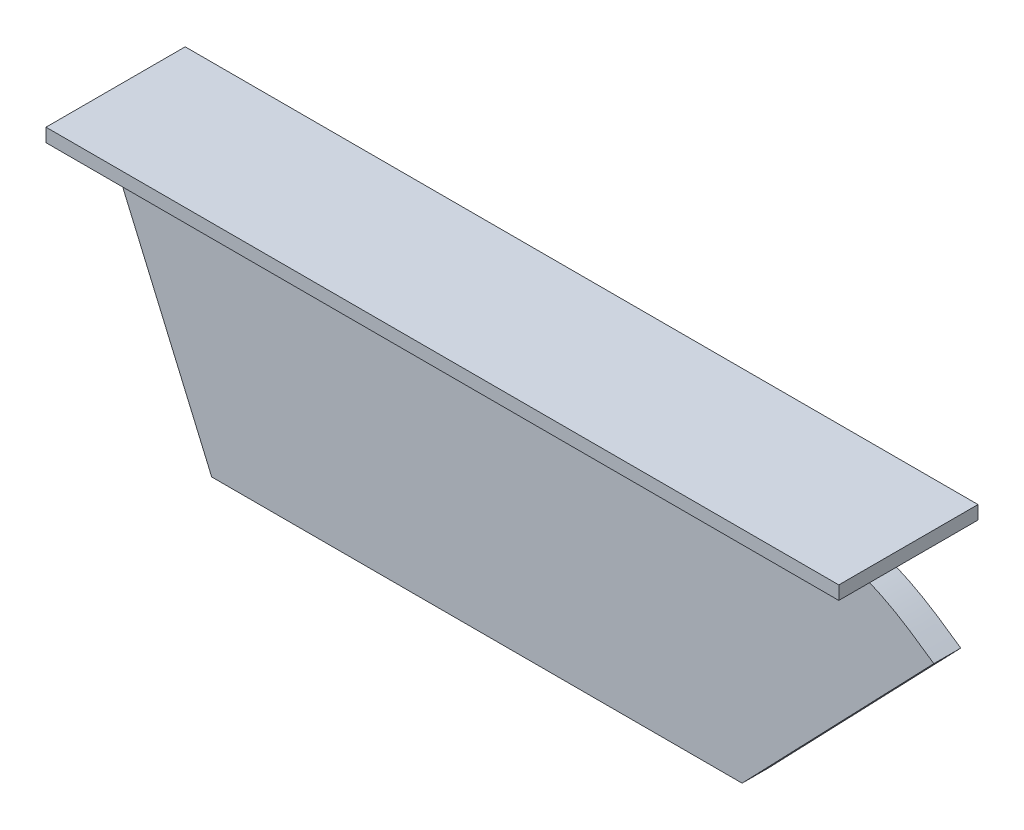
ISO-10303-21;
HEADER;
FILE_DESCRIPTION(('STEP AP214'),'2;1');
FILE_NAME('part.step','',(''),(''),'','','');
FILE_SCHEMA(('AUTOMOTIVE_DESIGN { 1 0 10303 214 1 1 1 1 }'));
ENDSEC;
DATA;
#1=APPLICATION_CONTEXT('core data for automotive mechanical design processes');
#2=APPLICATION_PROTOCOL_DEFINITION('international standard','automotive_design',2000,#1);
#3=PRODUCT_CONTEXT('',#1,'mechanical');
#4=PRODUCT('Part','Part','',(#3));
#5=PRODUCT_RELATED_PRODUCT_CATEGORY('part','',(#4));
#6=PRODUCT_DEFINITION_FORMATION('','',#4);
#7=PRODUCT_DEFINITION_CONTEXT('part definition',#1,'design');
#8=PRODUCT_DEFINITION('design','',#6,#7);
#9=PRODUCT_DEFINITION_SHAPE('','',#8);
#10=(LENGTH_UNIT() NAMED_UNIT(*) SI_UNIT(.MILLI.,.METRE.));
#11=(NAMED_UNIT(*) PLANE_ANGLE_UNIT() SI_UNIT($,.RADIAN.));
#12=(NAMED_UNIT(*) SI_UNIT($,.STERADIAN.) SOLID_ANGLE_UNIT());
#13=UNCERTAINTY_MEASURE_WITH_UNIT(LENGTH_MEASURE(1.E-05),#10,'distance_accuracy_value','');
#14=(GEOMETRIC_REPRESENTATION_CONTEXT(3) GLOBAL_UNCERTAINTY_ASSIGNED_CONTEXT((#13)) GLOBAL_UNIT_ASSIGNED_CONTEXT((#10,
#11,#12)) REPRESENTATION_CONTEXT('',''));
#15=CARTESIAN_POINT('',(0.,0.,0.));
#16=DIRECTION('',(0.,0.,1.));
#17=DIRECTION('',(1.,0.,0.));
#18=AXIS2_PLACEMENT_3D('',#15,#16,#17);
#19=CARTESIAN_POINT('',(14.9219959076632,5.49515134803942,0.));
#20=DIRECTION('',(0.,0.,-1.));
#21=DIRECTION('',(-1.,0.,0.));
#22=AXIS2_PLACEMENT_3D('',#19,#20,#21);
#23=PLANE('',#22);
#24=DIRECTION('',(-0.99488208865454,-0.101042712128979,0.));
#25=VECTOR('',#24,1.);
#26=CARTESIAN_POINT('',(14.5717616648174,8.94361158529031,0.));
#27=LINE('',#26,#25);
#28=CARTESIAN_POINT('',(-16.2112308203431,5.81721391101613,0.));
#29=VERTEX_POINT('',#28);
#30=CARTESIAN_POINT('',(-18.5524966546456,5.57942909971978,0.));
#31=VERTEX_POINT('',#30);
#32=EDGE_CURVE('E244',#29,#31,#27,.T.);
#33=ORIENTED_EDGE('',*,*,#32,.F.);
#34=DIRECTION('',(-1.,0.,0.));
#35=VECTOR('',#34,1.);
#36=CARTESIAN_POINT('',(14.9219959076632,5.81721391101613,0.));
#37=LINE('',#36,#35);
#38=CARTESIAN_POINT('',(10.5330727730155,5.81721391101613,0.));
#39=VERTEX_POINT('',#38);
#40=EDGE_CURVE('E119',#39,#29,#37,.T.);
#41=ORIENTED_EDGE('',*,*,#40,.F.);
#42=CARTESIAN_POINT('',(18.5375217741267,3.06940593852388,0.));
#43=CARTESIAN_POINT('',(17.947435083279,3.48376291672778,0.));
#44=CARTESIAN_POINT('',(17.3567712330806,3.89722808046411,0.));
#45=CARTESIAN_POINT('',(16.0978345123881,4.60423858505077,0.));
#46=CARTESIAN_POINT('',(15.4411782556395,4.89047439036039,0.));
#47=CARTESIAN_POINT('',(14.0969321608219,5.3592871656972,0.));
#48=CARTESIAN_POINT('',(13.407610170471,5.54292799800482,0.));
#49=CARTESIAN_POINT('',(11.977353684071,5.75786672362895,0.));
#50=CARTESIAN_POINT('',(11.2548253057176,5.78719905409013,0.));
#51=CARTESIAN_POINT('',(10.5330727730155,5.81721391101613,0.));
#52=B_SPLINE_CURVE_WITH_KNOTS('',3,(#42,#43,#44,#45,#46,#47,#48,#49,#50,#51),.UNSPECIFIED.,.F.,
.F.,(4,2,2,2,4),(0.,0.25,0.5,0.75,1.),.UNSPECIFIED.);
#53=CARTESIAN_POINT('',(18.5375217741267,3.06940593852388,0.));
#54=VERTEX_POINT('',#53);
#55=EDGE_CURVE('E261',#54,#39,#52,.T.);
#56=ORIENTED_EDGE('',*,*,#55,.F.);
#57=DIRECTION('',(0.693079494299739,0.720861161792767,0.));
#58=VECTOR('',#57,1.);
#59=CARTESIAN_POINT('',(18.0127072981266,2.52355459534235,0.));
#60=LINE('',#59,#58);
#61=CARTESIAN_POINT('',(9.9933882879564,-5.81721391101613,0.));
#62=VERTEX_POINT('',#61);
#63=EDGE_CURVE('E257',#62,#54,#60,.T.);
#64=ORIENTED_EDGE('',*,*,#63,.F.);
#65=DIRECTION('',(1.,0.,0.));
#66=VECTOR('',#65,1.);
#67=CARTESIAN_POINT('',(14.9219959076632,-5.81721391101613,0.));
#68=LINE('',#67,#66);
#69=CARTESIAN_POINT('',(-13.6448513390177,-5.81721391101613,0.));
#70=VERTEX_POINT('',#69);
#71=EDGE_CURVE('E253',#70,#62,#68,.T.);
#72=ORIENTED_EDGE('',*,*,#71,.F.);
#73=DIRECTION('',(0.395509839888418,-0.918461739296438,0.));
#74=VECTOR('',#73,1.);
#75=CARTESIAN_POINT('',(-13.2855328211196,-6.65163135813499,0.));
#76=LINE('',#75,#74);
#77=EDGE_CURVE('E249',#31,#70,#76,.T.);
#78=ORIENTED_EDGE('',*,*,#77,.F.);
#79=EDGE_LOOP('',(#33,#41,#56,#64,#72,#78));
#80=FACE_BOUND('',#79,.T.);
#81=ADVANCED_FACE('F94',(#80),#23,.T.);
#82=CARTESIAN_POINT('',(14.9219959076632,5.81721391101613,0.));
#83=DIRECTION('',(0.,1.,0.));
#84=DIRECTION('',(0.,0.,1.));
#85=AXIS2_PLACEMENT_3D('',#82,#83,#84);
#86=PLANE('',#85);
#87=CARTESIAN_POINT('',(10.1887691796569,5.81721391101613,0.599999999999999));
#88=DIRECTION('',(0.,1.,0.));
#89=DIRECTION('',(0.,0.,1.));
#90=AXIS2_PLACEMENT_3D('',#87,#88,#89);
#91=CIRCLE('',#90,0.3);
#92=CARTESIAN_POINT('',(10.1887691796569,5.81721391101613,0.899999999999999));
#93=VERTEX_POINT('',#92);
#94=EDGE_CURVE('E208',#93,#93,#91,.T.);
#95=ORIENTED_EDGE('',*,*,#94,.F.);
#96=EDGE_LOOP('',(#95));
#97=FACE_BOUND('',#96,.T.);
#98=CARTESIAN_POINT('',(1.48876917965688,5.81721391101613,0.599999999999999));
#99=DIRECTION('',(0.,1.,0.));
#100=DIRECTION('',(0.,0.,1.));
#101=AXIS2_PLACEMENT_3D('',#98,#99,#100);
#102=CIRCLE('',#101,0.3);
#103=CARTESIAN_POINT('',(1.48876917965688,5.81721391101613,0.899999999999999));
#104=VERTEX_POINT('',#103);
#105=EDGE_CURVE('E218',#104,#104,#102,.T.);
#106=ORIENTED_EDGE('',*,*,#105,.F.);
#107=EDGE_LOOP('',(#106));
#108=FACE_BOUND('',#107,.T.);
#109=CARTESIAN_POINT('',(-7.21123082034312,5.81721391101613,0.599999999999999));
#110=DIRECTION('',(0.,1.,0.));
#111=DIRECTION('',(0.,0.,1.));
#112=AXIS2_PLACEMENT_3D('',#109,#110,#111);
#113=CIRCLE('',#112,0.3);
#114=CARTESIAN_POINT('',(-7.21123082034312,5.81721391101613,0.899999999999999));
#115=VERTEX_POINT('',#114);
#116=EDGE_CURVE('E226',#115,#115,#113,.T.);
#117=ORIENTED_EDGE('',*,*,#116,.F.);
#118=EDGE_LOOP('',(#117));
#119=FACE_BOUND('',#118,.T.);
#120=DIRECTION('',(0.,0.,1.));
#121=VECTOR('',#120,1.);
#122=CARTESIAN_POINT('',(-16.2112308203431,5.81721391101613,0.));
#123=LINE('',#122,#121);
#124=CARTESIAN_POINT('',(-16.2112308203431,5.81721391101613,0.599999999999999));
#125=VERTEX_POINT('',#124);
#126=EDGE_CURVE('E97',#29,#125,#123,.T.);
#127=ORIENTED_EDGE('',*,*,#126,.T.);
#128=CARTESIAN_POINT('',(-15.9112308203431,5.81721391101613,0.599999999999999));
#129=DIRECTION('',(0.,1.,0.));
#130=DIRECTION('',(0.,0.,1.));
#131=AXIS2_PLACEMENT_3D('',#128,#129,#130);
#132=CIRCLE('',#131,0.3);
#133=EDGE_CURVE('E230',#125,#125,#132,.T.);
#134=ORIENTED_EDGE('',*,*,#133,.F.);
#135=CARTESIAN_POINT('',(-16.2112308203431,5.81721391101613,1.2));
#136=VERTEX_POINT('',#135);
#137=EDGE_CURVE('E268',#125,#136,#123,.T.);
#138=ORIENTED_EDGE('',*,*,#137,.T.);
#139=DIRECTION('',(-1.,0.,0.));
#140=VECTOR('',#139,1.);
#141=CARTESIAN_POINT('',(14.9219959076632,5.81721391101613,1.2));
#142=LINE('',#141,#140);
#143=CARTESIAN_POINT('',(10.5330727730155,5.81721391101613,1.2));
#144=VERTEX_POINT('',#143);
#145=EDGE_CURVE('E238',#144,#136,#142,.T.);
#146=ORIENTED_EDGE('',*,*,#145,.F.);
#147=DIRECTION('',(0.,0.,1.));
#148=VECTOR('',#147,1.);
#149=CARTESIAN_POINT('',(10.5330727730155,5.81721391101613,0.));
#150=LINE('',#149,#148);
#151=EDGE_CURVE('E12',#39,#144,#150,.T.);
#152=ORIENTED_EDGE('',*,*,#151,.F.);
#153=ORIENTED_EDGE('',*,*,#40,.T.);
#154=EDGE_LOOP('',(#127,#134,#138,#146,#152,#153));
#155=FACE_BOUND('',#154,.T.);
#156=ADVANCED_FACE('F279',(#97,#108,#119,#155),#86,.T.);
#157=DIRECTION('',(0.,0.,1.));
#158=VECTOR('',#157,1.);
#159=SURFACE_OF_LINEAR_EXTRUSION('',#52,#158);
#160=CARTESIAN_POINT('',(18.5375217741267,3.06940593852388,1.2));
#161=CARTESIAN_POINT('',(17.947435083279,3.48376291672778,1.2));
#162=CARTESIAN_POINT('',(17.3567712330806,3.89722808046411,1.2));
#163=CARTESIAN_POINT('',(16.0978345123881,4.60423858505077,1.2));
#164=CARTESIAN_POINT('',(15.4411782556395,4.89047439036039,1.2));
#165=CARTESIAN_POINT('',(14.0969321608219,5.3592871656972,1.2));
#166=CARTESIAN_POINT('',(13.407610170471,5.54292799800482,1.2));
#167=CARTESIAN_POINT('',(11.977353684071,5.75786672362895,1.2));
#168=CARTESIAN_POINT('',(11.2548253057176,5.78719905409013,1.2));
#169=CARTESIAN_POINT('',(10.5330727730155,5.81721391101613,1.2));
#170=B_SPLINE_CURVE_WITH_KNOTS('',3,(#160,#161,#162,#163,#164,#165,#166,#167,#168,#169),
.UNSPECIFIED.,.F.,.F.,(4,2,2,2,4),(0.,0.25,0.5,0.75,1.),.UNSPECIFIED.);
#171=CARTESIAN_POINT('',(18.5375217741267,3.06940593852388,1.2));
#172=VERTEX_POINT('',#171);
#173=EDGE_CURVE('E245',#172,#144,#170,.T.);
#174=ORIENTED_EDGE('',*,*,#173,.F.);
#175=DIRECTION('',(0.,0.,1.));
#176=VECTOR('',#175,1.);
#177=CARTESIAN_POINT('',(18.5375217741267,3.06940593852388,0.));
#178=LINE('',#177,#176);
#179=EDGE_CURVE('E103',#54,#172,#178,.T.);
#180=ORIENTED_EDGE('',*,*,#179,.F.);
#181=ORIENTED_EDGE('',*,*,#55,.T.);
#182=ORIENTED_EDGE('',*,*,#151,.T.);
#183=EDGE_LOOP('',(#174,#180,#181,#182));
#184=FACE_BOUND('',#183,.T.);
#185=ADVANCED_FACE('F274',(#184),#159,.T.);
#186=CARTESIAN_POINT('',(18.0127072981266,2.52355459534235,0.));
#187=DIRECTION('',(0.720861161792767,-0.693079494299739,0.));
#188=DIRECTION('',(0.693079494299739,0.720861161792767,0.));
#189=AXIS2_PLACEMENT_3D('',#186,#187,#188);
#190=PLANE('',#189);
#191=DIRECTION('',(0.693079494299739,0.720861161792767,0.));
#192=VECTOR('',#191,1.);
#193=CARTESIAN_POINT('',(18.0127072981266,2.52355459534235,1.2));
#194=LINE('',#193,#192);
#195=CARTESIAN_POINT('',(9.9933882879564,-5.81721391101613,1.2));
#196=VERTEX_POINT('',#195);
#197=EDGE_CURVE('E338',#196,#172,#194,.T.);
#198=ORIENTED_EDGE('',*,*,#197,.F.);
#199=DIRECTION('',(0.,0.,1.));
#200=VECTOR('',#199,1.);
#201=CARTESIAN_POINT('',(9.9933882879564,-5.81721391101613,0.));
#202=LINE('',#201,#200);
#203=EDGE_CURVE('E351',#62,#196,#202,.T.);
#204=ORIENTED_EDGE('',*,*,#203,.F.);
#205=ORIENTED_EDGE('',*,*,#63,.T.);
#206=ORIENTED_EDGE('',*,*,#179,.T.);
#207=EDGE_LOOP('',(#198,#204,#205,#206));
#208=FACE_BOUND('',#207,.T.);
#209=ADVANCED_FACE('F278',(#208),#190,.T.);
#210=CARTESIAN_POINT('',(14.9219959076632,-5.81721391101613,0.));
#211=DIRECTION('',(0.,-1.,0.));
#212=DIRECTION('',(0.,0.,-1.));
#213=AXIS2_PLACEMENT_3D('',#210,#211,#212);
#214=PLANE('',#213);
#215=DIRECTION('',(1.,0.,0.));
#216=VECTOR('',#215,1.);
#217=CARTESIAN_POINT('',(14.9219959076632,-5.81721391101613,1.2));
#218=LINE('',#217,#216);
#219=CARTESIAN_POINT('',(-13.6448513390177,-5.81721391101613,1.2));
#220=VERTEX_POINT('',#219);
#221=EDGE_CURVE('E334',#220,#196,#218,.T.);
#222=ORIENTED_EDGE('',*,*,#221,.F.);
#223=DIRECTION('',(0.,0.,1.));
#224=VECTOR('',#223,1.);
#225=CARTESIAN_POINT('',(-13.6448513390177,-5.81721391101613,0.));
#226=LINE('',#225,#224);
#227=EDGE_CURVE('E324',#70,#220,#226,.T.);
#228=ORIENTED_EDGE('',*,*,#227,.F.);
#229=ORIENTED_EDGE('',*,*,#71,.T.);
#230=ORIENTED_EDGE('',*,*,#203,.T.);
#231=EDGE_LOOP('',(#222,#228,#229,#230));
#232=FACE_BOUND('',#231,.T.);
#233=ADVANCED_FACE('F285',(#232),#214,.T.);
#234=CARTESIAN_POINT('',(-13.2855328211196,-6.65163135813499,0.));
#235=DIRECTION('',(-0.918461739296438,-0.395509839888418,0.));
#236=DIRECTION('',(0.395509839888418,-0.918461739296438,0.));
#237=AXIS2_PLACEMENT_3D('',#234,#235,#236);
#238=PLANE('',#237);
#239=DIRECTION('',(0.395509839888418,-0.918461739296438,0.));
#240=VECTOR('',#239,1.);
#241=CARTESIAN_POINT('',(-13.2855328211196,-6.65163135813499,1.2));
#242=LINE('',#241,#240);
#243=CARTESIAN_POINT('',(-18.5524966546456,5.57942909971978,1.2));
#244=VERTEX_POINT('',#243);
#245=EDGE_CURVE('E111',#244,#220,#242,.T.);
#246=ORIENTED_EDGE('',*,*,#245,.F.);
#247=DIRECTION('',(0.,0.,1.));
#248=VECTOR('',#247,1.);
#249=CARTESIAN_POINT('',(-18.5524966546456,5.57942909971978,0.));
#250=LINE('',#249,#248);
#251=EDGE_CURVE('E317',#31,#244,#250,.T.);
#252=ORIENTED_EDGE('',*,*,#251,.F.);
#253=ORIENTED_EDGE('',*,*,#77,.T.);
#254=ORIENTED_EDGE('',*,*,#227,.T.);
#255=EDGE_LOOP('',(#246,#252,#253,#254));
#256=FACE_BOUND('',#255,.T.);
#257=ADVANCED_FACE('F289',(#256),#238,.T.);
#258=CARTESIAN_POINT('',(14.5717616648174,8.94361158529031,0.));
#259=DIRECTION('',(-0.101042712128979,0.99488208865454,0.));
#260=DIRECTION('',(-0.99488208865454,-0.101042712128979,0.));
#261=AXIS2_PLACEMENT_3D('',#258,#259,#260);
#262=PLANE('',#261);
#263=DIRECTION('',(-0.99488208865454,-0.101042712128979,0.));
#264=VECTOR('',#263,1.);
#265=CARTESIAN_POINT('',(14.5717616648174,8.94361158529031,1.2));
#266=LINE('',#265,#264);
#267=EDGE_CURVE('E327',#136,#244,#266,.T.);
#268=ORIENTED_EDGE('',*,*,#267,.F.);
#269=ORIENTED_EDGE('',*,*,#137,.F.);
#270=ORIENTED_EDGE('',*,*,#126,.F.);
#271=ORIENTED_EDGE('',*,*,#32,.T.);
#272=ORIENTED_EDGE('',*,*,#251,.T.);
#273=EDGE_LOOP('',(#268,#269,#270,#271,#272));
#274=FACE_BOUND('',#273,.T.);
#275=ADVANCED_FACE('F293',(#274),#262,.T.);
#276=CARTESIAN_POINT('',(14.9219959076632,5.49515134803942,1.2));
#277=DIRECTION('',(0.,0.,-1.));
#278=DIRECTION('',(-1.,0.,0.));
#279=AXIS2_PLACEMENT_3D('',#276,#277,#278);
#280=PLANE('',#279);
#281=ORIENTED_EDGE('',*,*,#145,.T.);
#282=ORIENTED_EDGE('',*,*,#267,.T.);
#283=ORIENTED_EDGE('',*,*,#245,.T.);
#284=ORIENTED_EDGE('',*,*,#221,.T.);
#285=ORIENTED_EDGE('',*,*,#197,.T.);
#286=ORIENTED_EDGE('',*,*,#173,.T.);
#287=EDGE_LOOP('',(#281,#282,#283,#284,#285,#286));
#288=FACE_BOUND('',#287,.T.);
#289=ADVANCED_FACE('F296',(#288),#280,.F.);
#290=CARTESIAN_POINT('',(-15.9112308203431,6.11721391101613,0.599999999999999));
#291=DIRECTION('',(0.,-1.,0.));
#292=DIRECTION('',(0.,0.,-1.));
#293=AXIS2_PLACEMENT_3D('',#290,#291,#292);
#294=CYLINDRICAL_SURFACE('',#293,0.3);
#295=CARTESIAN_POINT('',(-15.9112308203431,6.11721391101613,0.599999999999999));
#296=DIRECTION('',(0.,1.,0.));
#297=DIRECTION('',(0.,0.,1.));
#298=AXIS2_PLACEMENT_3D('',#295,#296,#297);
#299=CIRCLE('',#298,0.3);
#300=CARTESIAN_POINT('',(-15.9112308203431,6.11721391101613,0.899999999999999));
#301=VERTEX_POINT('',#300);
#302=EDGE_CURVE('E234',#301,#301,#299,.T.);
#303=ORIENTED_EDGE('',*,*,#302,.F.);
#304=EDGE_LOOP('',(#303));
#305=FACE_BOUND('',#304,.T.);
#306=ORIENTED_EDGE('',*,*,#133,.T.);
#307=EDGE_LOOP('',(#306));
#308=FACE_BOUND('',#307,.T.);
#309=ADVANCED_FACE('F281',(#305,#308),#294,.T.);
#310=CARTESIAN_POINT('',(-7.21123082034312,6.11721391101613,0.599999999999999));
#311=DIRECTION('',(0.,-1.,0.));
#312=DIRECTION('',(0.,0.,-1.));
#313=AXIS2_PLACEMENT_3D('',#310,#311,#312);
#314=CYLINDRICAL_SURFACE('',#313,0.3);
#315=CARTESIAN_POINT('',(-7.21123082034312,6.11721391101613,0.599999999999999));
#316=DIRECTION('',(0.,1.,0.));
#317=DIRECTION('',(0.,0.,1.));
#318=AXIS2_PLACEMENT_3D('',#315,#316,#317);
#319=CIRCLE('',#318,0.3);
#320=CARTESIAN_POINT('',(-7.21123082034312,6.11721391101613,0.899999999999999));
#321=VERTEX_POINT('',#320);
#322=EDGE_CURVE('E222',#321,#321,#319,.T.);
#323=ORIENTED_EDGE('',*,*,#322,.F.);
#324=EDGE_LOOP('',(#323));
#325=FACE_BOUND('',#324,.T.);
#326=ORIENTED_EDGE('',*,*,#116,.T.);
#327=EDGE_LOOP('',(#326));
#328=FACE_BOUND('',#327,.T.);
#329=ADVANCED_FACE('F305',(#325,#328),#314,.T.);
#330=CARTESIAN_POINT('',(1.48876917965688,6.11721391101613,0.599999999999999));
#331=DIRECTION('',(0.,-1.,0.));
#332=DIRECTION('',(0.,0.,-1.));
#333=AXIS2_PLACEMENT_3D('',#330,#331,#332);
#334=CYLINDRICAL_SURFACE('',#333,0.3);
#335=CARTESIAN_POINT('',(1.48876917965688,6.11721391101613,0.599999999999999));
#336=DIRECTION('',(0.,1.,0.));
#337=DIRECTION('',(0.,0.,1.));
#338=AXIS2_PLACEMENT_3D('',#335,#336,#337);
#339=CIRCLE('',#338,0.3);
#340=CARTESIAN_POINT('',(1.48876917965688,6.11721391101613,0.899999999999999));
#341=VERTEX_POINT('',#340);
#342=EDGE_CURVE('E216',#341,#341,#339,.T.);
#343=ORIENTED_EDGE('',*,*,#342,.F.);
#344=EDGE_LOOP('',(#343));
#345=FACE_BOUND('',#344,.T.);
#346=ORIENTED_EDGE('',*,*,#105,.T.);
#347=EDGE_LOOP('',(#346));
#348=FACE_BOUND('',#347,.T.);
#349=ADVANCED_FACE('F400',(#345,#348),#334,.T.);
#350=CARTESIAN_POINT('',(10.1887691796569,6.11721391101613,0.599999999999999));
#351=DIRECTION('',(0.,-1.,0.));
#352=DIRECTION('',(0.,0.,-1.));
#353=AXIS2_PLACEMENT_3D('',#350,#351,#352);
#354=CYLINDRICAL_SURFACE('',#353,0.3);
#355=CARTESIAN_POINT('',(10.1887691796569,6.11721391101613,0.599999999999999));
#356=DIRECTION('',(0.,1.,0.));
#357=DIRECTION('',(0.,0.,1.));
#358=AXIS2_PLACEMENT_3D('',#355,#356,#357);
#359=CIRCLE('',#358,0.3);
#360=CARTESIAN_POINT('',(10.1887691796569,6.11721391101613,0.899999999999999));
#361=VERTEX_POINT('',#360);
#362=EDGE_CURVE('E203',#361,#361,#359,.T.);
#363=ORIENTED_EDGE('',*,*,#362,.F.);
#364=EDGE_LOOP('',(#363));
#365=FACE_BOUND('',#364,.T.);
#366=ORIENTED_EDGE('',*,*,#94,.T.);
#367=EDGE_LOOP('',(#366));
#368=FACE_BOUND('',#367,.T.);
#369=ADVANCED_FACE('F410',(#365,#368),#354,.T.);
#370=CARTESIAN_POINT('',(-18.3026888649226,6.71721391101613,-2.27688671051218));
#371=DIRECTION('',(1.,0.,0.));
#372=DIRECTION('',(0.,0.,-1.));
#373=AXIS2_PLACEMENT_3D('',#370,#371,#372);
#374=PLANE('',#373);
#375=DIRECTION('',(0.,0.,1.));
#376=VECTOR('',#375,1.);
#377=CARTESIAN_POINT('',(-18.3026888649226,6.11721391101613,-2.27688671051218));
#378=LINE('',#377,#376);
#379=CARTESIAN_POINT('',(-18.3026888649226,6.11721391101613,-2.27688671051218));
#380=VERTEX_POINT('',#379);
#381=CARTESIAN_POINT('',(-18.3026888649226,6.11721391101613,3.92640025902962));
#382=VERTEX_POINT('',#381);
#383=EDGE_CURVE('E201',#380,#382,#378,.T.);
#384=ORIENTED_EDGE('',*,*,#383,.T.);
#385=DIRECTION('',(0.,-1.,0.));
#386=VECTOR('',#385,1.);
#387=CARTESIAN_POINT('',(-18.3026888649226,6.71721391101613,3.92640025902962));
#388=LINE('',#387,#386);
#389=CARTESIAN_POINT('',(-18.3026888649226,6.71721391101613,3.92640025902962));
#390=VERTEX_POINT('',#389);
#391=EDGE_CURVE('E179',#390,#382,#388,.T.);
#392=ORIENTED_EDGE('',*,*,#391,.F.);
#393=DIRECTION('',(0.,0.,1.));
#394=VECTOR('',#393,1.);
#395=CARTESIAN_POINT('',(-18.3026888649226,6.71721391101613,-2.27688671051218));
#396=LINE('',#395,#394);
#397=CARTESIAN_POINT('',(-18.3026888649226,6.71721391101613,-2.27688671051218));
#398=VERTEX_POINT('',#397);
#399=EDGE_CURVE('E187',#398,#390,#396,.T.);
#400=ORIENTED_EDGE('',*,*,#399,.F.);
#401=DIRECTION('',(0.,-1.,0.));
#402=VECTOR('',#401,1.);
#403=CARTESIAN_POINT('',(-18.3026888649226,6.71721391101613,-2.27688671051218));
#404=LINE('',#403,#402);
#405=EDGE_CURVE('E550',#398,#380,#404,.T.);
#406=ORIENTED_EDGE('',*,*,#405,.T.);
#407=EDGE_LOOP('',(#384,#392,#400,#406));
#408=FACE_BOUND('',#407,.T.);
#409=ADVANCED_FACE('F199',(#408),#374,.F.);
#410=CARTESIAN_POINT('',(-18.3026888649226,6.71721391101613,3.92640025902962));
#411=DIRECTION('',(0.,0.,-1.));
#412=DIRECTION('',(-1.,0.,0.));
#413=AXIS2_PLACEMENT_3D('',#410,#411,#412);
#414=PLANE('',#413);
#415=DIRECTION('',(1.,0.,0.));
#416=VECTOR('',#415,1.);
#417=CARTESIAN_POINT('',(-18.3026888649226,6.11721391101613,3.92640025902962));
#418=LINE('',#417,#416);
#419=CARTESIAN_POINT('',(17.0290760485546,6.11721391101613,3.92640025902962));
#420=VERTEX_POINT('',#419);
#421=EDGE_CURVE('E537',#382,#420,#418,.T.);
#422=ORIENTED_EDGE('',*,*,#421,.T.);
#423=DIRECTION('',(0.,-1.,0.));
#424=VECTOR('',#423,1.);
#425=CARTESIAN_POINT('',(17.0290760485546,6.71721391101613,3.92640025902962));
#426=LINE('',#425,#424);
#427=CARTESIAN_POINT('',(17.0290760485546,6.71721391101613,3.92640025902962));
#428=VERTEX_POINT('',#427);
#429=EDGE_CURVE('E182',#428,#420,#426,.T.);
#430=ORIENTED_EDGE('',*,*,#429,.F.);
#431=DIRECTION('',(1.,0.,0.));
#432=VECTOR('',#431,1.);
#433=CARTESIAN_POINT('',(-18.3026888649226,6.71721391101613,3.92640025902962));
#434=LINE('',#433,#432);
#435=EDGE_CURVE('E175',#390,#428,#434,.T.);
#436=ORIENTED_EDGE('',*,*,#435,.F.);
#437=ORIENTED_EDGE('',*,*,#391,.T.);
#438=EDGE_LOOP('',(#422,#430,#436,#437));
#439=FACE_BOUND('',#438,.T.);
#440=ADVANCED_FACE('F177',(#439),#414,.F.);
#441=CARTESIAN_POINT('',(17.0290760485546,6.71721391101613,-2.27688671051218));
#442=DIRECTION('',(-1.,0.,0.));
#443=DIRECTION('',(0.,0.,1.));
#444=AXIS2_PLACEMENT_3D('',#441,#442,#443);
#445=PLANE('',#444);
#446=DIRECTION('',(0.,0.,-1.));
#447=VECTOR('',#446,1.);
#448=CARTESIAN_POINT('',(17.0290760485546,6.11721391101613,-2.27688671051218));
#449=LINE('',#448,#447);
#450=CARTESIAN_POINT('',(17.0290760485546,6.11721391101613,-2.27688671051218));
#451=VERTEX_POINT('',#450);
#452=EDGE_CURVE('E541',#420,#451,#449,.T.);
#453=ORIENTED_EDGE('',*,*,#452,.T.);
#454=DIRECTION('',(0.,-1.,0.));
#455=VECTOR('',#454,1.);
#456=CARTESIAN_POINT('',(17.0290760485546,6.71721391101613,-2.27688671051218));
#457=LINE('',#456,#455);
#458=CARTESIAN_POINT('',(17.0290760485546,6.71721391101613,-2.27688671051218));
#459=VERTEX_POINT('',#458);
#460=EDGE_CURVE('E210',#459,#451,#457,.T.);
#461=ORIENTED_EDGE('',*,*,#460,.F.);
#462=DIRECTION('',(0.,0.,-1.));
#463=VECTOR('',#462,1.);
#464=CARTESIAN_POINT('',(17.0290760485546,6.71721391101613,-2.27688671051218));
#465=LINE('',#464,#463);
#466=EDGE_CURVE('E186',#428,#459,#465,.T.);
#467=ORIENTED_EDGE('',*,*,#466,.F.);
#468=ORIENTED_EDGE('',*,*,#429,.T.);
#469=EDGE_LOOP('',(#453,#461,#467,#468));
#470=FACE_BOUND('',#469,.T.);
#471=ADVANCED_FACE('F440',(#470),#445,.F.);
#472=CARTESIAN_POINT('',(-18.3026888649226,6.71721391101613,-2.27688671051218));
#473=DIRECTION('',(0.,0.,1.));
#474=DIRECTION('',(1.,0.,0.));
#475=AXIS2_PLACEMENT_3D('',#472,#473,#474);
#476=PLANE('',#475);
#477=DIRECTION('',(-1.,0.,0.));
#478=VECTOR('',#477,1.);
#479=CARTESIAN_POINT('',(-18.3026888649226,6.11721391101613,-2.27688671051218));
#480=LINE('',#479,#478);
#481=EDGE_CURVE('E197',#451,#380,#480,.T.);
#482=ORIENTED_EDGE('',*,*,#481,.T.);
#483=ORIENTED_EDGE('',*,*,#405,.F.);
#484=DIRECTION('',(-1.,0.,0.));
#485=VECTOR('',#484,1.);
#486=CARTESIAN_POINT('',(-18.3026888649226,6.71721391101613,-2.27688671051218));
#487=LINE('',#486,#485);
#488=EDGE_CURVE('E192',#459,#398,#487,.T.);
#489=ORIENTED_EDGE('',*,*,#488,.F.);
#490=ORIENTED_EDGE('',*,*,#460,.T.);
#491=EDGE_LOOP('',(#482,#483,#489,#490));
#492=FACE_BOUND('',#491,.T.);
#493=ADVANCED_FACE('F450',(#492),#476,.F.);
#494=CARTESIAN_POINT('',(0.,6.71721391101613,0.));
#495=DIRECTION('',(0.,1.,0.));
#496=DIRECTION('',(0.,0.,1.));
#497=AXIS2_PLACEMENT_3D('',#494,#495,#496);
#498=PLANE('',#497);
#499=ORIENTED_EDGE('',*,*,#399,.T.);
#500=ORIENTED_EDGE('',*,*,#435,.T.);
#501=ORIENTED_EDGE('',*,*,#466,.T.);
#502=ORIENTED_EDGE('',*,*,#488,.T.);
#503=EDGE_LOOP('',(#499,#500,#501,#502));
#504=FACE_BOUND('',#503,.T.);
#505=ADVANCED_FACE('F190',(#504),#498,.T.);
#506=CARTESIAN_POINT('',(0.,6.11721391101613,0.));
#507=DIRECTION('',(0.,1.,0.));
#508=DIRECTION('',(0.,0.,1.));
#509=AXIS2_PLACEMENT_3D('',#506,#507,#508);
#510=PLANE('',#509);
#511=ORIENTED_EDGE('',*,*,#302,.T.);
#512=EDGE_LOOP('',(#511));
#513=FACE_BOUND('',#512,.T.);
#514=ORIENTED_EDGE('',*,*,#322,.T.);
#515=EDGE_LOOP('',(#514));
#516=FACE_BOUND('',#515,.T.);
#517=ORIENTED_EDGE('',*,*,#342,.T.);
#518=EDGE_LOOP('',(#517));
#519=FACE_BOUND('',#518,.T.);
#520=ORIENTED_EDGE('',*,*,#362,.T.);
#521=EDGE_LOOP('',(#520));
#522=FACE_BOUND('',#521,.T.);
#523=ORIENTED_EDGE('',*,*,#383,.F.);
#524=ORIENTED_EDGE('',*,*,#481,.F.);
#525=ORIENTED_EDGE('',*,*,#452,.F.);
#526=ORIENTED_EDGE('',*,*,#421,.F.);
#527=EDGE_LOOP('',(#523,#524,#525,#526));
#528=FACE_BOUND('',#527,.T.);
#529=ADVANCED_FACE('F471',(#513,#516,#519,#522,#528),#510,.F.);
#530=CLOSED_SHELL('',(#81,#156,#185,#209,#233,#257,#275,#289,#309,#329,#349,#369,#409,#440,#471,
#493,#505,#529));
#531=MANIFOLD_SOLID_BREP('B2',#530);
#532=ADVANCED_BREP_SHAPE_REPRESENTATION('',(#18,#531),#14);
#533=SHAPE_DEFINITION_REPRESENTATION(#9,#532);
ENDSEC;
END-ISO-10303-21;
